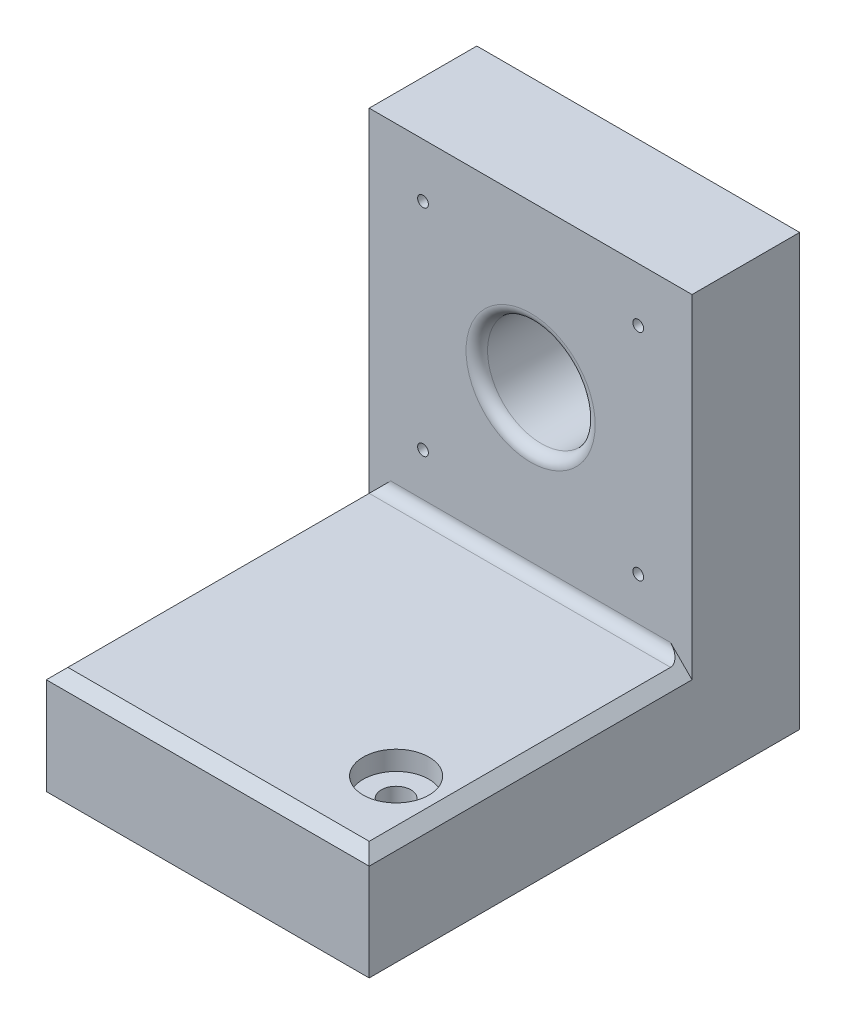
ISO-10303-21;
HEADER;
FILE_DESCRIPTION(('STEP AP214'),'2;1');
FILE_NAME('part.step','',(''),(''),'','','');
FILE_SCHEMA(('AUTOMOTIVE_DESIGN { 1 0 10303 214 1 1 1 1 }'));
ENDSEC;
DATA;
#1=APPLICATION_CONTEXT('core data for automotive mechanical design processes');
#2=APPLICATION_PROTOCOL_DEFINITION('international standard','automotive_design',2000,#1);
#3=PRODUCT_CONTEXT('',#1,'mechanical');
#4=PRODUCT('Part','Part','',(#3));
#5=PRODUCT_RELATED_PRODUCT_CATEGORY('part','',(#4));
#6=PRODUCT_DEFINITION_FORMATION('','',#4);
#7=PRODUCT_DEFINITION_CONTEXT('part definition',#1,'design');
#8=PRODUCT_DEFINITION('design','',#6,#7);
#9=PRODUCT_DEFINITION_SHAPE('','',#8);
#10=(LENGTH_UNIT() NAMED_UNIT(*) SI_UNIT(.MILLI.,.METRE.));
#11=(NAMED_UNIT(*) PLANE_ANGLE_UNIT() SI_UNIT($,.RADIAN.));
#12=(NAMED_UNIT(*) SI_UNIT($,.STERADIAN.) SOLID_ANGLE_UNIT());
#13=UNCERTAINTY_MEASURE_WITH_UNIT(LENGTH_MEASURE(1.E-05),#10,'distance_accuracy_value','');
#14=(GEOMETRIC_REPRESENTATION_CONTEXT(3) GLOBAL_UNCERTAINTY_ASSIGNED_CONTEXT((#13)) GLOBAL_UNIT_ASSIGNED_CONTEXT((#10,
#11,#12)) REPRESENTATION_CONTEXT('',''));
#15=CARTESIAN_POINT('',(0.,0.,0.));
#16=DIRECTION('',(0.,0.,1.));
#17=DIRECTION('',(1.,0.,0.));
#18=AXIS2_PLACEMENT_3D('',#15,#16,#17);
#19=CARTESIAN_POINT('',(0.,20.,60.));
#20=DIRECTION('',(0.,0.,-1.));
#21=DIRECTION('',(-1.,0.,0.));
#22=AXIS2_PLACEMENT_3D('',#19,#20,#21);
#23=PLANE('',#22);
#24=DIRECTION('',(0.,-1.,0.));
#25=VECTOR('',#24,1.);
#26=CARTESIAN_POINT('',(60.,20.,60.));
#27=LINE('',#26,#25);
#28=CARTESIAN_POINT('',(60.,18.,60.));
#29=VERTEX_POINT('',#28);
#30=CARTESIAN_POINT('',(60.,0.,60.));
#31=VERTEX_POINT('',#30);
#32=EDGE_CURVE('E115',#29,#31,#27,.T.);
#33=ORIENTED_EDGE('',*,*,#32,.F.);
#34=DIRECTION('',(1.,0.,0.));
#35=VECTOR('',#34,1.);
#36=CARTESIAN_POINT('',(0.,18.,60.));
#37=LINE('',#36,#35);
#38=CARTESIAN_POINT('',(0.,18.,60.));
#39=VERTEX_POINT('',#38);
#40=EDGE_CURVE('E103',#39,#29,#37,.T.);
#41=ORIENTED_EDGE('',*,*,#40,.F.);
#42=DIRECTION('',(0.,-1.,0.));
#43=VECTOR('',#42,1.);
#44=CARTESIAN_POINT('',(0.,20.,60.));
#45=LINE('',#44,#43);
#46=CARTESIAN_POINT('',(0.,0.,60.));
#47=VERTEX_POINT('',#46);
#48=EDGE_CURVE('E113',#39,#47,#45,.T.);
#49=ORIENTED_EDGE('',*,*,#48,.T.);
#50=DIRECTION('',(1.,0.,0.));
#51=VECTOR('',#50,1.);
#52=CARTESIAN_POINT('',(0.,0.,60.));
#53=LINE('',#52,#51);
#54=EDGE_CURVE('E236',#47,#31,#53,.T.);
#55=ORIENTED_EDGE('',*,*,#54,.T.);
#56=EDGE_LOOP('',(#33,#41,#49,#55));
#57=FACE_BOUND('',#56,.T.);
#58=ADVANCED_FACE('F33',(#57),#23,.F.);
#59=CARTESIAN_POINT('',(60.,20.,0.));
#60=DIRECTION('',(-1.,0.,0.));
#61=DIRECTION('',(0.,0.,1.));
#62=AXIS2_PLACEMENT_3D('',#59,#60,#61);
#63=PLANE('',#62);
#64=DIRECTION('',(0.,-1.,0.));
#65=VECTOR('',#64,1.);
#66=CARTESIAN_POINT('',(60.,80.,0.));
#67=LINE('',#66,#65);
#68=CARTESIAN_POINT('',(60.,80.,0.));
#69=VERTEX_POINT('',#68);
#70=CARTESIAN_POINT('',(60.,18.,0.));
#71=VERTEX_POINT('',#70);
#72=EDGE_CURVE('E234',#69,#71,#67,.T.);
#73=ORIENTED_EDGE('',*,*,#72,.T.);
#74=DIRECTION('',(0.,0.,1.));
#75=VECTOR('',#74,1.);
#76=CARTESIAN_POINT('',(60.,18.,0.));
#77=LINE('',#76,#75);
#78=EDGE_CURVE('E166',#71,#29,#77,.T.);
#79=ORIENTED_EDGE('',*,*,#78,.T.);
#80=ORIENTED_EDGE('',*,*,#32,.T.);
#81=DIRECTION('',(0.,0.,-1.));
#82=VECTOR('',#81,1.);
#83=CARTESIAN_POINT('',(60.,0.,0.));
#84=LINE('',#83,#82);
#85=CARTESIAN_POINT('',(60.,0.,-20.));
#86=VERTEX_POINT('',#85);
#87=EDGE_CURVE('E130',#31,#86,#84,.T.);
#88=ORIENTED_EDGE('',*,*,#87,.T.);
#89=DIRECTION('',(0.,-1.,0.));
#90=VECTOR('',#89,1.);
#91=CARTESIAN_POINT('',(60.,80.,-20.));
#92=LINE('',#91,#90);
#93=CARTESIAN_POINT('',(60.,80.,-20.));
#94=VERTEX_POINT('',#93);
#95=EDGE_CURVE('E231',#94,#86,#92,.T.);
#96=ORIENTED_EDGE('',*,*,#95,.F.);
#97=DIRECTION('',(0.,0.,1.));
#98=VECTOR('',#97,1.);
#99=CARTESIAN_POINT('',(60.,80.,0.));
#100=LINE('',#99,#98);
#101=EDGE_CURVE('E216',#94,#69,#100,.T.);
#102=ORIENTED_EDGE('',*,*,#101,.T.);
#103=EDGE_LOOP('',(#73,#79,#80,#88,#96,#102));
#104=FACE_BOUND('',#103,.T.);
#105=ADVANCED_FACE('F239',(#104),#63,.F.);
#106=CARTESIAN_POINT('',(0.,20.,0.));
#107=DIRECTION('',(1.,0.,0.));
#108=DIRECTION('',(0.,0.,-1.));
#109=AXIS2_PLACEMENT_3D('',#106,#107,#108);
#110=PLANE('',#109);
#111=ORIENTED_EDGE('',*,*,#48,.F.);
#112=DIRECTION('',(0.,0.,1.));
#113=VECTOR('',#112,1.);
#114=CARTESIAN_POINT('',(0.,18.,0.));
#115=LINE('',#114,#113);
#116=CARTESIAN_POINT('',(0.,18.,0.));
#117=VERTEX_POINT('',#116);
#118=EDGE_CURVE('E118',#117,#39,#115,.T.);
#119=ORIENTED_EDGE('',*,*,#118,.F.);
#120=DIRECTION('',(0.,-1.,0.));
#121=VECTOR('',#120,1.);
#122=CARTESIAN_POINT('',(0.,80.,0.));
#123=LINE('',#122,#121);
#124=CARTESIAN_POINT('',(0.,80.,0.));
#125=VERTEX_POINT('',#124);
#126=EDGE_CURVE('E225',#125,#117,#123,.T.);
#127=ORIENTED_EDGE('',*,*,#126,.F.);
#128=DIRECTION('',(0.,0.,-1.));
#129=VECTOR('',#128,1.);
#130=CARTESIAN_POINT('',(0.,80.,0.));
#131=LINE('',#130,#129);
#132=CARTESIAN_POINT('',(0.,80.,-20.));
#133=VERTEX_POINT('',#132);
#134=EDGE_CURVE('E222',#125,#133,#131,.T.);
#135=ORIENTED_EDGE('',*,*,#134,.T.);
#136=DIRECTION('',(0.,-1.,0.));
#137=VECTOR('',#136,1.);
#138=CARTESIAN_POINT('',(0.,80.,-20.));
#139=LINE('',#138,#137);
#140=CARTESIAN_POINT('',(0.,0.,-20.));
#141=VERTEX_POINT('',#140);
#142=EDGE_CURVE('E229',#133,#141,#139,.T.);
#143=ORIENTED_EDGE('',*,*,#142,.T.);
#144=DIRECTION('',(0.,0.,1.));
#145=VECTOR('',#144,1.);
#146=CARTESIAN_POINT('',(0.,0.,0.));
#147=LINE('',#146,#145);
#148=EDGE_CURVE('E125',#141,#47,#147,.T.);
#149=ORIENTED_EDGE('',*,*,#148,.T.);
#150=EDGE_LOOP('',(#111,#119,#127,#135,#143,#149));
#151=FACE_BOUND('',#150,.T.);
#152=ADVANCED_FACE('F123',(#151),#110,.F.);
#153=CARTESIAN_POINT('',(0.,20.,0.));
#154=DIRECTION('',(0.,1.,0.));
#155=DIRECTION('',(0.,0.,1.));
#156=AXIS2_PLACEMENT_3D('',#153,#154,#155);
#157=PLANE('',#156);
#158=DIRECTION('',(1.,0.,0.));
#159=VECTOR('',#158,1.);
#160=CARTESIAN_POINT('',(0.,20.,58.));
#161=LINE('',#160,#159);
#162=CARTESIAN_POINT('',(2.00000000000002,20.,58.));
#163=VERTEX_POINT('',#162);
#164=CARTESIAN_POINT('',(58.,20.,58.));
#165=VERTEX_POINT('',#164);
#166=EDGE_CURVE('E48',#163,#165,#161,.T.);
#167=ORIENTED_EDGE('',*,*,#166,.T.);
#168=DIRECTION('',(0.,0.,1.));
#169=VECTOR('',#168,1.);
#170=CARTESIAN_POINT('',(58.,20.,0.));
#171=LINE('',#170,#169);
#172=CARTESIAN_POINT('',(58.,20.,2.));
#173=VERTEX_POINT('',#172);
#174=EDGE_CURVE('E156',#173,#165,#171,.T.);
#175=ORIENTED_EDGE('',*,*,#174,.F.);
#176=DIRECTION('',(-1.,0.,0.));
#177=VECTOR('',#176,1.);
#178=CARTESIAN_POINT('',(2.00000000000001,20.,2.));
#179=LINE('',#178,#177);
#180=CARTESIAN_POINT('',(2.00000000000001,20.,2.));
#181=VERTEX_POINT('',#180);
#182=EDGE_CURVE('E145',#173,#181,#179,.T.);
#183=ORIENTED_EDGE('',*,*,#182,.T.);
#184=DIRECTION('',(0.,0.,1.));
#185=VECTOR('',#184,1.);
#186=CARTESIAN_POINT('',(2.00000000000001,20.,0.));
#187=LINE('',#186,#185);
#188=EDGE_CURVE('E121',#181,#163,#187,.T.);
#189=ORIENTED_EDGE('',*,*,#188,.T.);
#190=EDGE_LOOP('',(#167,#175,#183,#189));
#191=FACE_BOUND('',#190,.T.);
#192=CARTESIAN_POINT('',(50.,20.,45.));
#193=DIRECTION('',(0.,1.,0.));
#194=DIRECTION('',(0.,0.,1.));
#195=AXIS2_PLACEMENT_3D('',#192,#193,#194);
#196=CIRCLE('',#195,6.12);
#197=CARTESIAN_POINT('',(50.,20.,51.12));
#198=VERTEX_POINT('',#197);
#199=EDGE_CURVE('E181',#198,#198,#196,.T.);
#200=ORIENTED_EDGE('',*,*,#199,.F.);
#201=EDGE_LOOP('',(#200));
#202=FACE_BOUND('',#201,.T.);
#203=ADVANCED_FACE('F164',(#191,#202),#157,.T.);
#204=CARTESIAN_POINT('',(0.,0.,0.));
#205=DIRECTION('',(0.,1.,0.));
#206=DIRECTION('',(0.,0.,1.));
#207=AXIS2_PLACEMENT_3D('',#204,#205,#206);
#208=PLANE('',#207);
#209=CARTESIAN_POINT('',(50.,0.,45.));
#210=DIRECTION('',(0.,1.,0.));
#211=DIRECTION('',(0.,0.,1.));
#212=AXIS2_PLACEMENT_3D('',#209,#210,#211);
#213=CIRCLE('',#212,2.75);
#214=CARTESIAN_POINT('',(50.,0.,47.75));
#215=VERTEX_POINT('',#214);
#216=EDGE_CURVE('E171',#215,#215,#213,.T.);
#217=ORIENTED_EDGE('',*,*,#216,.T.);
#218=EDGE_LOOP('',(#217));
#219=FACE_BOUND('',#218,.T.);
#220=ORIENTED_EDGE('',*,*,#54,.F.);
#221=ORIENTED_EDGE('',*,*,#148,.F.);
#222=DIRECTION('',(1.,0.,0.));
#223=VECTOR('',#222,1.);
#224=CARTESIAN_POINT('',(0.,0.,-20.));
#225=LINE('',#224,#223);
#226=EDGE_CURVE('E210',#141,#86,#225,.T.);
#227=ORIENTED_EDGE('',*,*,#226,.T.);
#228=ORIENTED_EDGE('',*,*,#87,.F.);
#229=EDGE_LOOP('',(#220,#221,#227,#228));
#230=FACE_BOUND('',#229,.T.);
#231=ADVANCED_FACE('F246',(#219,#230),#208,.F.);
#232=CARTESIAN_POINT('',(0.,80.,0.));
#233=DIRECTION('',(0.,0.,1.));
#234=DIRECTION('',(1.,0.,0.));
#235=AXIS2_PLACEMENT_3D('',#232,#233,#234);
#236=PLANE('',#235);
#237=CARTESIAN_POINT('',(10.,30.,0.));
#238=DIRECTION('',(0.,0.,1.));
#239=DIRECTION('',(1.,0.,0.));
#240=AXIS2_PLACEMENT_3D('',#237,#238,#239);
#241=CIRCLE('',#240,1.);
#242=CARTESIAN_POINT('',(11.,30.,0.));
#243=VERTEX_POINT('',#242);
#244=EDGE_CURVE('E186',#243,#243,#241,.T.);
#245=ORIENTED_EDGE('',*,*,#244,.F.);
#246=EDGE_LOOP('',(#245));
#247=FACE_BOUND('',#246,.T.);
#248=CARTESIAN_POINT('',(50.,30.,0.));
#249=DIRECTION('',(0.,0.,1.));
#250=DIRECTION('',(1.,0.,0.));
#251=AXIS2_PLACEMENT_3D('',#248,#249,#250);
#252=CIRCLE('',#251,0.999999999999998);
#253=CARTESIAN_POINT('',(51.,30.,0.));
#254=VERTEX_POINT('',#253);
#255=EDGE_CURVE('E199',#254,#254,#252,.T.);
#256=ORIENTED_EDGE('',*,*,#255,.F.);
#257=EDGE_LOOP('',(#256));
#258=FACE_BOUND('',#257,.T.);
#259=CARTESIAN_POINT('',(50.,70.,0.));
#260=DIRECTION('',(0.,0.,1.));
#261=DIRECTION('',(1.,0.,0.));
#262=AXIS2_PLACEMENT_3D('',#259,#260,#261);
#263=CIRCLE('',#262,0.999999999999998);
#264=CARTESIAN_POINT('',(51.,70.,0.));
#265=VERTEX_POINT('',#264);
#266=EDGE_CURVE('E193',#265,#265,#263,.T.);
#267=ORIENTED_EDGE('',*,*,#266,.F.);
#268=EDGE_LOOP('',(#267));
#269=FACE_BOUND('',#268,.T.);
#270=CARTESIAN_POINT('',(10.,70.,0.));
#271=DIRECTION('',(0.,0.,1.));
#272=DIRECTION('',(1.,0.,0.));
#273=AXIS2_PLACEMENT_3D('',#270,#271,#272);
#274=CIRCLE('',#273,1.);
#275=CARTESIAN_POINT('',(11.,70.,0.));
#276=VERTEX_POINT('',#275);
#277=EDGE_CURVE('E192',#276,#276,#274,.T.);
#278=ORIENTED_EDGE('',*,*,#277,.F.);
#279=EDGE_LOOP('',(#278));
#280=FACE_BOUND('',#279,.T.);
#281=CARTESIAN_POINT('',(30.,50.,0.));
#282=DIRECTION('',(0.,0.,1.));
#283=DIRECTION('',(1.,0.,0.));
#284=AXIS2_PLACEMENT_3D('',#281,#282,#283);
#285=CIRCLE('',#284,12.);
#286=CARTESIAN_POINT('',(42.,50.,0.));
#287=VERTEX_POINT('',#286);
#288=EDGE_CURVE('E142',#287,#287,#285,.F.);
#289=ORIENTED_EDGE('',*,*,#288,.T.);
#290=EDGE_LOOP('',(#289));
#291=FACE_BOUND('',#290,.T.);
#292=DIRECTION('',(0.707106781186548,0.707106781186547,0.));
#293=VECTOR('',#292,1.);
#294=CARTESIAN_POINT('',(2.00000000000001,20.,0.));
#295=LINE('',#294,#293);
#296=CARTESIAN_POINT('',(4.00000000000001,22.,0.));
#297=VERTEX_POINT('',#296);
#298=EDGE_CURVE('E55',#117,#297,#295,.T.);
#299=ORIENTED_EDGE('',*,*,#298,.T.);
#300=DIRECTION('',(-1.,0.,0.));
#301=VECTOR('',#300,1.);
#302=CARTESIAN_POINT('',(58.,22.,0.));
#303=LINE('',#302,#301);
#304=CARTESIAN_POINT('',(56.,22.,0.));
#305=VERTEX_POINT('',#304);
#306=EDGE_CURVE('E148',#297,#305,#303,.F.);
#307=ORIENTED_EDGE('',*,*,#306,.T.);
#308=DIRECTION('',(0.707106781186547,-0.707106781186547,0.));
#309=VECTOR('',#308,1.);
#310=CARTESIAN_POINT('',(58.,20.,0.));
#311=LINE('',#310,#309);
#312=EDGE_CURVE('E159',#305,#71,#311,.T.);
#313=ORIENTED_EDGE('',*,*,#312,.T.);
#314=ORIENTED_EDGE('',*,*,#72,.F.);
#315=DIRECTION('',(-1.,0.,0.));
#316=VECTOR('',#315,1.);
#317=CARTESIAN_POINT('',(0.,80.,0.));
#318=LINE('',#317,#316);
#319=EDGE_CURVE('E213',#69,#125,#318,.T.);
#320=ORIENTED_EDGE('',*,*,#319,.T.);
#321=ORIENTED_EDGE('',*,*,#126,.T.);
#322=EDGE_LOOP('',(#299,#307,#313,#314,#320,#321));
#323=FACE_BOUND('',#322,.T.);
#324=ADVANCED_FACE('F251',(#247,#258,#269,#280,#291,#323),#236,.T.);
#325=CARTESIAN_POINT('',(0.,80.,-20.));
#326=DIRECTION('',(0.,0.,-1.));
#327=DIRECTION('',(-1.,0.,0.));
#328=AXIS2_PLACEMENT_3D('',#325,#326,#327);
#329=PLANE('',#328);
#330=CARTESIAN_POINT('',(30.,50.,-20.));
#331=DIRECTION('',(0.,0.,-1.));
#332=DIRECTION('',(-1.,0.,0.));
#333=AXIS2_PLACEMENT_3D('',#330,#331,#332);
#334=CIRCLE('',#333,12.);
#335=CARTESIAN_POINT('',(18.,50.,-20.));
#336=VERTEX_POINT('',#335);
#337=EDGE_CURVE('E128',#336,#336,#334,.F.);
#338=ORIENTED_EDGE('',*,*,#337,.T.);
#339=EDGE_LOOP('',(#338));
#340=FACE_BOUND('',#339,.T.);
#341=ORIENTED_EDGE('',*,*,#226,.F.);
#342=ORIENTED_EDGE('',*,*,#142,.F.);
#343=DIRECTION('',(1.,0.,0.));
#344=VECTOR('',#343,1.);
#345=CARTESIAN_POINT('',(0.,80.,-20.));
#346=LINE('',#345,#344);
#347=EDGE_CURVE('E219',#133,#94,#346,.T.);
#348=ORIENTED_EDGE('',*,*,#347,.T.);
#349=ORIENTED_EDGE('',*,*,#95,.T.);
#350=EDGE_LOOP('',(#341,#342,#348,#349));
#351=FACE_BOUND('',#350,.T.);
#352=ADVANCED_FACE('F244',(#340,#351),#329,.T.);
#353=CARTESIAN_POINT('',(0.,80.,0.));
#354=DIRECTION('',(0.,1.,0.));
#355=DIRECTION('',(0.,0.,1.));
#356=AXIS2_PLACEMENT_3D('',#353,#354,#355);
#357=PLANE('',#356);
#358=ORIENTED_EDGE('',*,*,#319,.F.);
#359=ORIENTED_EDGE('',*,*,#101,.F.);
#360=ORIENTED_EDGE('',*,*,#347,.F.);
#361=ORIENTED_EDGE('',*,*,#134,.F.);
#362=EDGE_LOOP('',(#358,#359,#360,#361));
#363=FACE_BOUND('',#362,.T.);
#364=ADVANCED_FACE('F250',(#363),#357,.T.);
#365=CARTESIAN_POINT('',(30.,50.,-20.));
#366=DIRECTION('',(0.,0.,1.));
#367=DIRECTION('',(1.,0.,0.));
#368=AXIS2_PLACEMENT_3D('',#365,#366,#367);
#369=CYLINDRICAL_SURFACE('',#368,10.);
#370=CARTESIAN_POINT('',(30.,50.,-18.));
#371=DIRECTION('',(0.,0.,-1.));
#372=DIRECTION('',(-1.,0.,0.));
#373=AXIS2_PLACEMENT_3D('',#370,#371,#372);
#374=CIRCLE('',#373,10.);
#375=CARTESIAN_POINT('',(20.,50.,-18.));
#376=VERTEX_POINT('',#375);
#377=EDGE_CURVE('E139',#376,#376,#374,.T.);
#378=ORIENTED_EDGE('',*,*,#377,.T.);
#379=EDGE_LOOP('',(#378));
#380=FACE_BOUND('',#379,.T.);
#381=CARTESIAN_POINT('',(30.,50.,-2.));
#382=DIRECTION('',(0.,0.,1.));
#383=DIRECTION('',(1.,0.,0.));
#384=AXIS2_PLACEMENT_3D('',#381,#382,#383);
#385=CIRCLE('',#384,10.);
#386=CARTESIAN_POINT('',(40.,50.,-2.));
#387=VERTEX_POINT('',#386);
#388=EDGE_CURVE('E136',#387,#387,#385,.T.);
#389=ORIENTED_EDGE('',*,*,#388,.T.);
#390=EDGE_LOOP('',(#389));
#391=FACE_BOUND('',#390,.T.);
#392=ADVANCED_FACE('F277',(#380,#391),#369,.F.);
#393=CARTESIAN_POINT('',(30.,50.,-18.));
#394=DIRECTION('',(0.,0.,-1.));
#395=DIRECTION('',(-1.,0.,0.));
#396=AXIS2_PLACEMENT_3D('',#393,#394,#395);
#397=TOROIDAL_SURFACE('',#396,12.,2.);
#398=ORIENTED_EDGE('',*,*,#377,.F.);
#399=EDGE_LOOP('',(#398));
#400=FACE_BOUND('',#399,.T.);
#401=ORIENTED_EDGE('',*,*,#337,.F.);
#402=EDGE_LOOP('',(#401));
#403=FACE_BOUND('',#402,.T.);
#404=ADVANCED_FACE('F274',(#400,#403),#397,.T.);
#405=CARTESIAN_POINT('',(30.,50.,-2.));
#406=DIRECTION('',(0.,0.,1.));
#407=DIRECTION('',(1.,0.,0.));
#408=AXIS2_PLACEMENT_3D('',#405,#406,#407);
#409=TOROIDAL_SURFACE('',#408,12.,2.);
#410=ORIENTED_EDGE('',*,*,#288,.F.);
#411=EDGE_LOOP('',(#410));
#412=FACE_BOUND('',#411,.T.);
#413=ORIENTED_EDGE('',*,*,#388,.F.);
#414=EDGE_LOOP('',(#413));
#415=FACE_BOUND('',#414,.T.);
#416=ADVANCED_FACE('F276',(#412,#415),#409,.T.);
#417=CARTESIAN_POINT('',(10.,70.,-10.));
#418=DIRECTION('',(0.,0.,1.));
#419=DIRECTION('',(1.,0.,0.));
#420=AXIS2_PLACEMENT_3D('',#417,#418,#419);
#421=CYLINDRICAL_SURFACE('',#420,1.);
#422=CARTESIAN_POINT('',(10.,70.,-10.));
#423=DIRECTION('',(0.,0.,1.));
#424=DIRECTION('',(1.,0.,0.));
#425=AXIS2_PLACEMENT_3D('',#422,#423,#424);
#426=CIRCLE('',#425,1.);
#427=CARTESIAN_POINT('',(11.,70.,-10.));
#428=VERTEX_POINT('',#427);
#429=EDGE_CURVE('E207',#428,#428,#426,.T.);
#430=ORIENTED_EDGE('',*,*,#429,.F.);
#431=EDGE_LOOP('',(#430));
#432=FACE_BOUND('',#431,.T.);
#433=ORIENTED_EDGE('',*,*,#277,.T.);
#434=EDGE_LOOP('',(#433));
#435=FACE_BOUND('',#434,.T.);
#436=ADVANCED_FACE('F280',(#432,#435),#421,.F.);
#437=CARTESIAN_POINT('',(10.,70.,-10.));
#438=DIRECTION('',(0.,0.,1.));
#439=DIRECTION('',(1.,0.,0.));
#440=AXIS2_PLACEMENT_3D('',#437,#438,#439);
#441=PLANE('',#440);
#442=ORIENTED_EDGE('',*,*,#429,.T.);
#443=EDGE_LOOP('',(#442));
#444=FACE_BOUND('',#443,.T.);
#445=ADVANCED_FACE('F285',(#444),#441,.T.);
#446=CARTESIAN_POINT('',(50.,70.,-10.));
#447=DIRECTION('',(0.,0.,1.));
#448=DIRECTION('',(1.,0.,0.));
#449=AXIS2_PLACEMENT_3D('',#446,#447,#448);
#450=CYLINDRICAL_SURFACE('',#449,0.999999999999998);
#451=CARTESIAN_POINT('',(50.,70.,-10.));
#452=DIRECTION('',(0.,0.,1.));
#453=DIRECTION('',(1.,0.,0.));
#454=AXIS2_PLACEMENT_3D('',#451,#452,#453);
#455=CIRCLE('',#454,0.999999999999998);
#456=CARTESIAN_POINT('',(51.,70.,-10.));
#457=VERTEX_POINT('',#456);
#458=EDGE_CURVE('E189',#457,#457,#455,.T.);
#459=ORIENTED_EDGE('',*,*,#458,.F.);
#460=EDGE_LOOP('',(#459));
#461=FACE_BOUND('',#460,.T.);
#462=ORIENTED_EDGE('',*,*,#266,.T.);
#463=EDGE_LOOP('',(#462));
#464=FACE_BOUND('',#463,.T.);
#465=ADVANCED_FACE('F302',(#461,#464),#450,.F.);
#466=CARTESIAN_POINT('',(50.,70.,-10.));
#467=DIRECTION('',(0.,0.,1.));
#468=DIRECTION('',(1.,0.,0.));
#469=AXIS2_PLACEMENT_3D('',#466,#467,#468);
#470=PLANE('',#469);
#471=ORIENTED_EDGE('',*,*,#458,.T.);
#472=EDGE_LOOP('',(#471));
#473=FACE_BOUND('',#472,.T.);
#474=ADVANCED_FACE('F317',(#473),#470,.T.);
#475=CARTESIAN_POINT('',(50.,30.,-10.));
#476=DIRECTION('',(0.,0.,1.));
#477=DIRECTION('',(1.,0.,0.));
#478=AXIS2_PLACEMENT_3D('',#475,#476,#477);
#479=CYLINDRICAL_SURFACE('',#478,0.999999999999998);
#480=CARTESIAN_POINT('',(50.,30.,-10.));
#481=DIRECTION('',(0.,0.,1.));
#482=DIRECTION('',(1.,0.,0.));
#483=AXIS2_PLACEMENT_3D('',#480,#481,#482);
#484=CIRCLE('',#483,0.999999999999998);
#485=CARTESIAN_POINT('',(51.,30.,-10.));
#486=VERTEX_POINT('',#485);
#487=EDGE_CURVE('E196',#486,#486,#484,.T.);
#488=ORIENTED_EDGE('',*,*,#487,.F.);
#489=EDGE_LOOP('',(#488));
#490=FACE_BOUND('',#489,.T.);
#491=ORIENTED_EDGE('',*,*,#255,.T.);
#492=EDGE_LOOP('',(#491));
#493=FACE_BOUND('',#492,.T.);
#494=ADVANCED_FACE('F314',(#490,#493),#479,.F.);
#495=CARTESIAN_POINT('',(50.,30.,-10.));
#496=DIRECTION('',(0.,0.,1.));
#497=DIRECTION('',(1.,0.,0.));
#498=AXIS2_PLACEMENT_3D('',#495,#496,#497);
#499=PLANE('',#498);
#500=ORIENTED_EDGE('',*,*,#487,.T.);
#501=EDGE_LOOP('',(#500));
#502=FACE_BOUND('',#501,.T.);
#503=ADVANCED_FACE('F308',(#502),#499,.T.);
#504=CARTESIAN_POINT('',(10.,30.,-10.));
#505=DIRECTION('',(0.,0.,1.));
#506=DIRECTION('',(1.,0.,0.));
#507=AXIS2_PLACEMENT_3D('',#504,#505,#506);
#508=CYLINDRICAL_SURFACE('',#507,1.);
#509=CARTESIAN_POINT('',(10.,30.,-10.));
#510=DIRECTION('',(0.,0.,1.));
#511=DIRECTION('',(1.,0.,0.));
#512=AXIS2_PLACEMENT_3D('',#509,#510,#511);
#513=CIRCLE('',#512,1.);
#514=CARTESIAN_POINT('',(11.,30.,-10.));
#515=VERTEX_POINT('',#514);
#516=EDGE_CURVE('E202',#515,#515,#513,.T.);
#517=ORIENTED_EDGE('',*,*,#516,.F.);
#518=EDGE_LOOP('',(#517));
#519=FACE_BOUND('',#518,.T.);
#520=ORIENTED_EDGE('',*,*,#244,.T.);
#521=EDGE_LOOP('',(#520));
#522=FACE_BOUND('',#521,.T.);
#523=ADVANCED_FACE('F304',(#519,#522),#508,.F.);
#524=CARTESIAN_POINT('',(10.,30.,-10.));
#525=DIRECTION('',(0.,0.,1.));
#526=DIRECTION('',(1.,0.,0.));
#527=AXIS2_PLACEMENT_3D('',#524,#525,#526);
#528=PLANE('',#527);
#529=ORIENTED_EDGE('',*,*,#516,.T.);
#530=EDGE_LOOP('',(#529));
#531=FACE_BOUND('',#530,.T.);
#532=ADVANCED_FACE('F307',(#531),#528,.T.);
#533=CARTESIAN_POINT('',(50.,16.42,45.));
#534=DIRECTION('',(0.,1.,0.));
#535=DIRECTION('',(0.,0.,1.));
#536=AXIS2_PLACEMENT_3D('',#533,#534,#535);
#537=CYLINDRICAL_SURFACE('',#536,6.12);
#538=CARTESIAN_POINT('',(50.,16.42,45.));
#539=DIRECTION('',(0.,1.,0.));
#540=DIRECTION('',(0.,0.,1.));
#541=AXIS2_PLACEMENT_3D('',#538,#539,#540);
#542=CIRCLE('',#541,6.12);
#543=CARTESIAN_POINT('',(50.,16.42,51.12));
#544=VERTEX_POINT('',#543);
#545=EDGE_CURVE('E183',#544,#544,#542,.T.);
#546=CARTESIAN_POINT('',(50.,16.42,51.12));
#547=CARTESIAN_POINT('',(50.,16.4572916666667,51.12));
#548=CARTESIAN_POINT('',(50.,16.4945833333333,51.12));
#549=CARTESIAN_POINT('',(50.,16.5691666666667,51.12));
#550=CARTESIAN_POINT('',(50.,16.6064583333333,51.12));
#551=CARTESIAN_POINT('',(50.,16.6810416666667,51.12));
#552=CARTESIAN_POINT('',(50.,16.7183333333333,51.12));
#553=CARTESIAN_POINT('',(50.,16.7929166666667,51.12));
#554=CARTESIAN_POINT('',(50.,16.8302083333333,51.12));
#555=CARTESIAN_POINT('',(50.,16.9047916666667,51.12));
#556=CARTESIAN_POINT('',(50.,16.9420833333333,51.12));
#557=CARTESIAN_POINT('',(50.,17.0166666666667,51.12));
#558=CARTESIAN_POINT('',(50.,17.0539583333333,51.12));
#559=CARTESIAN_POINT('',(50.,17.1285416666667,51.12));
#560=CARTESIAN_POINT('',(50.,17.1658333333333,51.12));
#561=CARTESIAN_POINT('',(50.,17.2404166666667,51.12));
#562=CARTESIAN_POINT('',(50.,17.2777083333333,51.12));
#563=CARTESIAN_POINT('',(50.,17.3522916666667,51.12));
#564=CARTESIAN_POINT('',(50.,17.3895833333333,51.12));
#565=CARTESIAN_POINT('',(50.,17.4641666666667,51.12));
#566=CARTESIAN_POINT('',(50.,17.5014583333333,51.12));
#567=CARTESIAN_POINT('',(50.,17.5760416666667,51.12));
#568=CARTESIAN_POINT('',(50.,17.6133333333333,51.12));
#569=CARTESIAN_POINT('',(50.,17.6879166666667,51.12));
#570=CARTESIAN_POINT('',(50.,17.7252083333333,51.12));
#571=CARTESIAN_POINT('',(50.,17.7997916666667,51.12));
#572=CARTESIAN_POINT('',(50.,17.8370833333333,51.12));
#573=CARTESIAN_POINT('',(50.,17.9116666666667,51.12));
#574=CARTESIAN_POINT('',(50.,17.9489583333333,51.12));
#575=CARTESIAN_POINT('',(50.,18.0235416666667,51.12));
#576=CARTESIAN_POINT('',(50.,18.0608333333333,51.12));
#577=CARTESIAN_POINT('',(50.,18.1354166666667,51.12));
#578=CARTESIAN_POINT('',(50.,18.1727083333333,51.12));
#579=CARTESIAN_POINT('',(50.,18.2472916666667,51.12));
#580=CARTESIAN_POINT('',(50.,18.2845833333333,51.12));
#581=CARTESIAN_POINT('',(50.,18.3591666666667,51.12));
#582=CARTESIAN_POINT('',(50.,18.3964583333333,51.12));
#583=CARTESIAN_POINT('',(50.,18.4710416666667,51.12));
#584=CARTESIAN_POINT('',(50.,18.5083333333333,51.12));
#585=CARTESIAN_POINT('',(50.,18.5829166666667,51.12));
#586=CARTESIAN_POINT('',(50.,18.6202083333333,51.12));
#587=CARTESIAN_POINT('',(50.,18.6947916666667,51.12));
#588=CARTESIAN_POINT('',(50.,18.7320833333333,51.12));
#589=CARTESIAN_POINT('',(50.,18.8066666666667,51.12));
#590=CARTESIAN_POINT('',(50.,18.8439583333333,51.12));
#591=CARTESIAN_POINT('',(50.,18.9185416666667,51.12));
#592=CARTESIAN_POINT('',(50.,18.9558333333333,51.12));
#593=CARTESIAN_POINT('',(50.,19.0304166666667,51.12));
#594=CARTESIAN_POINT('',(50.,19.0677083333333,51.12));
#595=CARTESIAN_POINT('',(50.,19.1422916666667,51.12));
#596=CARTESIAN_POINT('',(50.,19.1795833333333,51.12));
#597=CARTESIAN_POINT('',(50.,19.2541666666667,51.12));
#598=CARTESIAN_POINT('',(50.,19.2914583333333,51.12));
#599=CARTESIAN_POINT('',(50.,19.3660416666667,51.12));
#600=CARTESIAN_POINT('',(50.,19.4033333333333,51.12));
#601=CARTESIAN_POINT('',(50.,19.4779166666667,51.12));
#602=CARTESIAN_POINT('',(50.,19.5152083333333,51.12));
#603=CARTESIAN_POINT('',(50.,19.5897916666667,51.12));
#604=CARTESIAN_POINT('',(50.,19.6270833333333,51.12));
#605=CARTESIAN_POINT('',(50.,19.7016666666667,51.12));
#606=CARTESIAN_POINT('',(50.,19.7389583333333,51.12));
#607=CARTESIAN_POINT('',(50.,19.8135416666667,51.12));
#608=CARTESIAN_POINT('',(50.,19.8508333333333,51.12));
#609=CARTESIAN_POINT('',(50.,19.9254166666667,51.12));
#610=CARTESIAN_POINT('',(50.,19.9627083333333,51.12));
#611=CARTESIAN_POINT('',(50.,20.,51.12));
#612=B_SPLINE_CURVE_WITH_KNOTS('',3,(#546,#547,#548,#549,#550,#551,#552,#553,#554,#555,#556,
#557,#558,#559,#560,#561,#562,#563,#564,#565,#566,#567,#568,#569,#570,#571,#572,#573,#574,#575,
#576,#577,#578,#579,#580,#581,#582,#583,#584,#585,#586,#587,#588,#589,#590,#591,#592,#593,#594,
#595,#596,#597,#598,#599,#600,#601,#602,#603,#604,#605,#606,#607,#608,#609,#610,#611),
.UNSPECIFIED.,.F.,.F.,(4,2,2,2,2,2,2,2,2,2,2,2,2,2,2,2,2,2,2,2,2,2,2,2,2,2,2,2,2,2,2,2,4),(0.,
0.111875000000001,0.223750000000002,0.335625000000003,0.447500000000003,0.559375000000001,
0.671250000000002,0.783125000000003,0.895000000000003,1.006875,1.11875,1.230625,1.3425,1.454375,
1.56625,1.678125,1.79,1.901875,2.01375,2.125625,2.2375,2.349375,2.46125,2.573125,2.685,2.796875,
2.90875,3.020625,3.1325,3.244375,3.35625,3.468125,3.58),.UNSPECIFIED.);
#613=EDGE_CURVE('BSEAM312',#544,#198,#612,.T.);
#614=ORIENTED_EDGE('',*,*,#545,.F.);
#615=ORIENTED_EDGE('',*,*,#199,.T.);
#616=ORIENTED_EDGE('',*,*,#613,.T.);
#617=ORIENTED_EDGE('',*,*,#613,.F.);
#618=EDGE_LOOP('',(#614,#616,#615,#617));
#619=FACE_BOUND('',#618,.T.);
#620=ADVANCED_FACE('F312',(#619),#537,.F.);
#621=CARTESIAN_POINT('',(50.,16.42,45.));
#622=DIRECTION('',(0.,1.,0.));
#623=DIRECTION('',(0.,0.,1.));
#624=AXIS2_PLACEMENT_3D('',#621,#622,#623);
#625=PLANE('',#624);
#626=CARTESIAN_POINT('',(50.,16.42,45.));
#627=DIRECTION('',(0.,1.,0.));
#628=DIRECTION('',(0.,0.,1.));
#629=AXIS2_PLACEMENT_3D('',#626,#627,#628);
#630=CIRCLE('',#629,2.75);
#631=CARTESIAN_POINT('',(50.,16.42,47.75));
#632=VERTEX_POINT('',#631);
#633=EDGE_CURVE('E168',#632,#632,#630,.T.);
#634=ORIENTED_EDGE('',*,*,#633,.F.);
#635=EDGE_LOOP('',(#634));
#636=FACE_BOUND('',#635,.T.);
#637=ORIENTED_EDGE('',*,*,#545,.T.);
#638=EDGE_LOOP('',(#637));
#639=FACE_BOUND('',#638,.T.);
#640=ADVANCED_FACE('F330',(#636,#639),#625,.T.);
#641=CARTESIAN_POINT('',(50.,0.,45.));
#642=DIRECTION('',(0.,1.,0.));
#643=DIRECTION('',(0.,0.,1.));
#644=AXIS2_PLACEMENT_3D('',#641,#642,#643);
#645=CYLINDRICAL_SURFACE('',#644,2.75);
#646=ORIENTED_EDGE('',*,*,#216,.F.);
#647=EDGE_LOOP('',(#646));
#648=FACE_BOUND('',#647,.T.);
#649=ORIENTED_EDGE('',*,*,#633,.T.);
#650=EDGE_LOOP('',(#649));
#651=FACE_BOUND('',#650,.T.);
#652=ADVANCED_FACE('F334',(#648,#651),#645,.F.);
#653=CARTESIAN_POINT('',(58.,20.,0.));
#654=DIRECTION('',(-0.707106781186547,-0.707106781186547,0.));
#655=DIRECTION('',(0.707106781186548,-0.707106781186548,0.));
#656=AXIS2_PLACEMENT_3D('',#653,#654,#655);
#657=PLANE('',#656);
#658=ORIENTED_EDGE('',*,*,#174,.T.);
#659=DIRECTION('',(0.577350269189626,-0.577350269189626,0.577350269189626));
#660=VECTOR('',#659,1.);
#661=CARTESIAN_POINT('',(38.6666666666667,39.3333333333333,38.6666666666667));
#662=LINE('',#661,#660);
#663=EDGE_CURVE('E177',#165,#29,#662,.T.);
#664=ORIENTED_EDGE('',*,*,#663,.T.);
#665=ORIENTED_EDGE('',*,*,#78,.F.);
#666=ORIENTED_EDGE('',*,*,#312,.F.);
#667=CARTESIAN_POINT('',(56.,22.,2.));
#668=DIRECTION('',(-0.707106781186547,-0.707106781186547,0.));
#669=DIRECTION('',(0.707106781186548,-0.707106781186548,0.));
#670=AXIS2_PLACEMENT_3D('',#667,#668,#669);
#671=ELLIPSE('',#670,2.82842712474619,2.);
#672=EDGE_CURVE('E41',#305,#173,#671,.T.);
#673=ORIENTED_EDGE('',*,*,#672,.T.);
#674=EDGE_LOOP('',(#658,#664,#665,#666,#673));
#675=FACE_BOUND('',#674,.T.);
#676=ADVANCED_FACE('F155',(#675),#657,.F.);
#677=CARTESIAN_POINT('',(2.00000000000001,20.,0.));
#678=DIRECTION('',(0.707106781186547,-0.707106781186548,0.));
#679=DIRECTION('',(0.707106781186548,0.707106781186547,0.));
#680=AXIS2_PLACEMENT_3D('',#677,#678,#679);
#681=PLANE('',#680);
#682=ORIENTED_EDGE('',*,*,#118,.T.);
#683=DIRECTION('',(0.577350269189626,0.577350269189626,-0.577350269189626));
#684=VECTOR('',#683,1.);
#685=CARTESIAN_POINT('',(21.3333333333334,39.3333333333333,38.6666666666667));
#686=LINE('',#685,#684);
#687=EDGE_CURVE('E11',#39,#163,#686,.T.);
#688=ORIENTED_EDGE('',*,*,#687,.T.);
#689=ORIENTED_EDGE('',*,*,#188,.F.);
#690=CARTESIAN_POINT('',(4.00000000000001,22.,2.));
#691=DIRECTION('',(0.707106781186547,-0.707106781186548,0.));
#692=DIRECTION('',(0.707106781186548,0.707106781186547,0.));
#693=AXIS2_PLACEMENT_3D('',#690,#691,#692);
#694=ELLIPSE('',#693,2.82842712474619,2.);
#695=EDGE_CURVE('E150',#181,#297,#694,.T.);
#696=ORIENTED_EDGE('',*,*,#695,.T.);
#697=ORIENTED_EDGE('',*,*,#298,.F.);
#698=EDGE_LOOP('',(#682,#688,#689,#696,#697));
#699=FACE_BOUND('',#698,.T.);
#700=ADVANCED_FACE('F119',(#699),#681,.F.);
#701=CARTESIAN_POINT('',(0.,22.,2.));
#702=DIRECTION('',(1.,0.,0.));
#703=DIRECTION('',(0.,0.,-1.));
#704=AXIS2_PLACEMENT_3D('',#701,#702,#703);
#705=CYLINDRICAL_SURFACE('',#704,2.);
#706=ORIENTED_EDGE('',*,*,#672,.F.);
#707=ORIENTED_EDGE('',*,*,#306,.F.);
#708=ORIENTED_EDGE('',*,*,#695,.F.);
#709=ORIENTED_EDGE('',*,*,#182,.F.);
#710=EDGE_LOOP('',(#706,#707,#708,#709));
#711=FACE_BOUND('',#710,.T.);
#712=ADVANCED_FACE('F35',(#711),#705,.F.);
#713=CARTESIAN_POINT('',(0.,18.,60.));
#714=DIRECTION('',(0.,-0.707106781186547,-0.707106781186547));
#715=DIRECTION('',(0.,0.707106781186548,-0.707106781186548));
#716=AXIS2_PLACEMENT_3D('',#713,#714,#715);
#717=PLANE('',#716);
#718=ORIENTED_EDGE('',*,*,#166,.F.);
#719=ORIENTED_EDGE('',*,*,#687,.F.);
#720=ORIENTED_EDGE('',*,*,#40,.T.);
#721=ORIENTED_EDGE('',*,*,#663,.F.);
#722=EDGE_LOOP('',(#718,#719,#720,#721));
#723=FACE_BOUND('',#722,.T.);
#724=ADVANCED_FACE('F102',(#723),#717,.F.);
#725=CLOSED_SHELL('',(#58,#105,#152,#203,#231,#324,#352,#364,#392,#404,#416,#436,#445,#465,#474,
#494,#503,#523,#532,#620,#640,#652,#676,#700,#712,#724));
#726=MANIFOLD_SOLID_BREP('B2',#725);
#727=ADVANCED_BREP_SHAPE_REPRESENTATION('',(#18,#726),#14);
#728=SHAPE_DEFINITION_REPRESENTATION(#9,#727);
ENDSEC;
END-ISO-10303-21;
